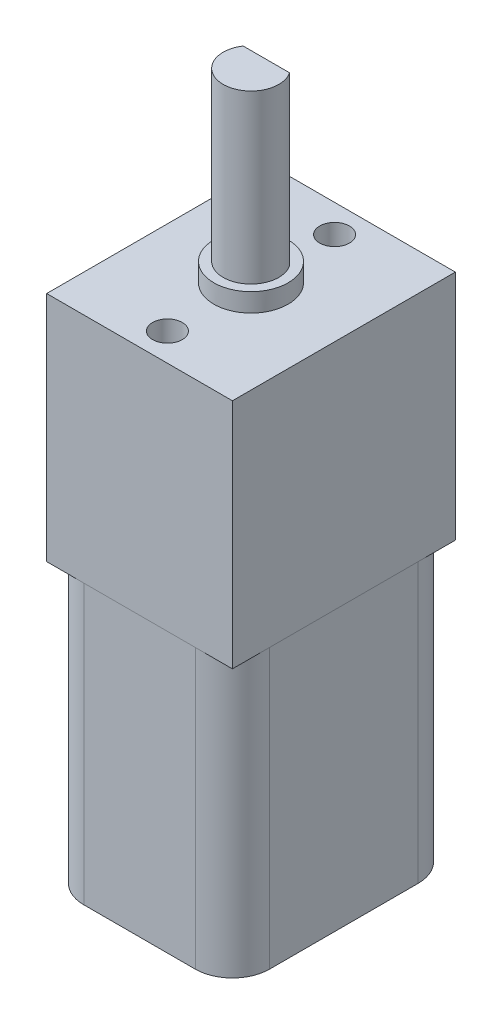
ISO-10303-21;
HEADER;
FILE_DESCRIPTION(('STEP AP214'),'2;1');
FILE_NAME('part.step','',(''),(''),'','','');
FILE_SCHEMA(('AUTOMOTIVE_DESIGN { 1 0 10303 214 1 1 1 1 }'));
ENDSEC;
DATA;
#1=APPLICATION_CONTEXT('core data for automotive mechanical design processes');
#2=APPLICATION_PROTOCOL_DEFINITION('international standard','automotive_design',2000,#1);
#3=PRODUCT_CONTEXT('',#1,'mechanical');
#4=PRODUCT('Part','Part','',(#3));
#5=PRODUCT_RELATED_PRODUCT_CATEGORY('part','',(#4));
#6=PRODUCT_DEFINITION_FORMATION('','',#4);
#7=PRODUCT_DEFINITION_CONTEXT('part definition',#1,'design');
#8=PRODUCT_DEFINITION('design','',#6,#7);
#9=PRODUCT_DEFINITION_SHAPE('','',#8);
#10=(LENGTH_UNIT() NAMED_UNIT(*) SI_UNIT(.MILLI.,.METRE.));
#11=(NAMED_UNIT(*) PLANE_ANGLE_UNIT() SI_UNIT($,.RADIAN.));
#12=(NAMED_UNIT(*) SI_UNIT($,.STERADIAN.) SOLID_ANGLE_UNIT());
#13=UNCERTAINTY_MEASURE_WITH_UNIT(LENGTH_MEASURE(1.E-05),#10,'distance_accuracy_value','');
#14=(GEOMETRIC_REPRESENTATION_CONTEXT(3) GLOBAL_UNCERTAINTY_ASSIGNED_CONTEXT((#13)) GLOBAL_UNIT_ASSIGNED_CONTEXT((#10,
#11,#12)) REPRESENTATION_CONTEXT('',''));
#15=CARTESIAN_POINT('',(0.,0.,0.));
#16=DIRECTION('',(0.,0.,1.));
#17=DIRECTION('',(1.,0.,0.));
#18=AXIS2_PLACEMENT_3D('',#15,#16,#17);
#19=CARTESIAN_POINT('',(0.,15.,0.));
#20=DIRECTION('',(0.,-1.,0.));
#21=DIRECTION('',(0.,0.,-1.));
#22=AXIS2_PLACEMENT_3D('',#19,#20,#21);
#23=PLANE('',#22);
#24=DIRECTION('',(-1.,0.,0.));
#25=VECTOR('',#24,1.);
#26=CARTESIAN_POINT('',(0.,15.,0.));
#27=LINE('',#26,#25);
#28=CARTESIAN_POINT('',(10.,15.,0.));
#29=VERTEX_POINT('',#28);
#30=CARTESIAN_POINT('',(0.,15.,0.));
#31=VERTEX_POINT('',#30);
#32=EDGE_CURVE('E127',#29,#31,#27,.T.);
#33=ORIENTED_EDGE('',*,*,#32,.T.);
#34=DIRECTION('',(0.,0.,-1.));
#35=VECTOR('',#34,1.);
#36=CARTESIAN_POINT('',(0.,15.,0.));
#37=LINE('',#36,#35);
#38=CARTESIAN_POINT('',(0.,15.,-12.));
#39=VERTEX_POINT('',#38);
#40=EDGE_CURVE('E115',#31,#39,#37,.T.);
#41=ORIENTED_EDGE('',*,*,#40,.T.);
#42=DIRECTION('',(1.,0.,0.));
#43=VECTOR('',#42,1.);
#44=CARTESIAN_POINT('',(0.,15.,-12.));
#45=LINE('',#44,#43);
#46=CARTESIAN_POINT('',(10.,15.,-12.));
#47=VERTEX_POINT('',#46);
#48=EDGE_CURVE('E121',#39,#47,#45,.T.);
#49=ORIENTED_EDGE('',*,*,#48,.T.);
#50=DIRECTION('',(0.,0.,1.));
#51=VECTOR('',#50,1.);
#52=CARTESIAN_POINT('',(10.,15.,0.));
#53=LINE('',#52,#51);
#54=EDGE_CURVE('E132',#47,#29,#53,.T.);
#55=ORIENTED_EDGE('',*,*,#54,.T.);
#56=EDGE_LOOP('',(#33,#41,#49,#55));
#57=FACE_BOUND('',#56,.T.);
#58=ADVANCED_FACE('F55',(#57),#23,.T.);
#59=CARTESIAN_POINT('',(0.,27.5,0.));
#60=DIRECTION('',(1.,0.,0.));
#61=DIRECTION('',(0.,0.,-1.));
#62=AXIS2_PLACEMENT_3D('',#59,#60,#61);
#63=PLANE('',#62);
#64=ORIENTED_EDGE('',*,*,#40,.F.);
#65=DIRECTION('',(0.,-1.,0.));
#66=VECTOR('',#65,1.);
#67=CARTESIAN_POINT('',(0.,27.5,0.));
#68=LINE('',#67,#66);
#69=CARTESIAN_POINT('',(0.,27.5,0.));
#70=VERTEX_POINT('',#69);
#71=EDGE_CURVE('E136',#70,#31,#68,.T.);
#72=ORIENTED_EDGE('',*,*,#71,.F.);
#73=DIRECTION('',(0.,0.,1.));
#74=VECTOR('',#73,1.);
#75=CARTESIAN_POINT('',(0.,27.5,0.));
#76=LINE('',#75,#74);
#77=CARTESIAN_POINT('',(0.,27.5,-12.));
#78=VERTEX_POINT('',#77);
#79=EDGE_CURVE('E113',#78,#70,#76,.T.);
#80=ORIENTED_EDGE('',*,*,#79,.F.);
#81=DIRECTION('',(0.,-1.,0.));
#82=VECTOR('',#81,1.);
#83=CARTESIAN_POINT('',(0.,27.5,-12.));
#84=LINE('',#83,#82);
#85=EDGE_CURVE('E57',#78,#39,#84,.T.);
#86=ORIENTED_EDGE('',*,*,#85,.T.);
#87=EDGE_LOOP('',(#64,#72,#80,#86));
#88=FACE_BOUND('',#87,.T.);
#89=ADVANCED_FACE('F109',(#88),#63,.F.);
#90=CARTESIAN_POINT('',(0.,27.5,0.));
#91=DIRECTION('',(0.,0.,-1.));
#92=DIRECTION('',(-1.,0.,0.));
#93=AXIS2_PLACEMENT_3D('',#90,#91,#92);
#94=PLANE('',#93);
#95=ORIENTED_EDGE('',*,*,#32,.F.);
#96=DIRECTION('',(0.,-1.,0.));
#97=VECTOR('',#96,1.);
#98=CARTESIAN_POINT('',(10.,27.5,0.));
#99=LINE('',#98,#97);
#100=CARTESIAN_POINT('',(10.,27.5,0.));
#101=VERTEX_POINT('',#100);
#102=EDGE_CURVE('E139',#101,#29,#99,.T.);
#103=ORIENTED_EDGE('',*,*,#102,.F.);
#104=DIRECTION('',(1.,0.,0.));
#105=VECTOR('',#104,1.);
#106=CARTESIAN_POINT('',(0.,27.5,0.));
#107=LINE('',#106,#105);
#108=EDGE_CURVE('E166',#70,#101,#107,.T.);
#109=ORIENTED_EDGE('',*,*,#108,.F.);
#110=ORIENTED_EDGE('',*,*,#71,.T.);
#111=EDGE_LOOP('',(#95,#103,#109,#110));
#112=FACE_BOUND('',#111,.T.);
#113=ADVANCED_FACE('F144',(#112),#94,.F.);
#114=CARTESIAN_POINT('',(10.,27.5,0.));
#115=DIRECTION('',(-1.,0.,0.));
#116=DIRECTION('',(0.,0.,1.));
#117=AXIS2_PLACEMENT_3D('',#114,#115,#116);
#118=PLANE('',#117);
#119=ORIENTED_EDGE('',*,*,#54,.F.);
#120=DIRECTION('',(0.,-1.,0.));
#121=VECTOR('',#120,1.);
#122=CARTESIAN_POINT('',(10.,27.5,-12.));
#123=LINE('',#122,#121);
#124=CARTESIAN_POINT('',(10.,27.5,-12.));
#125=VERTEX_POINT('',#124);
#126=EDGE_CURVE('E116',#125,#47,#123,.T.);
#127=ORIENTED_EDGE('',*,*,#126,.F.);
#128=DIRECTION('',(0.,0.,-1.));
#129=VECTOR('',#128,1.);
#130=CARTESIAN_POINT('',(10.,27.5,0.));
#131=LINE('',#130,#129);
#132=EDGE_CURVE('E141',#101,#125,#131,.T.);
#133=ORIENTED_EDGE('',*,*,#132,.F.);
#134=ORIENTED_EDGE('',*,*,#102,.T.);
#135=EDGE_LOOP('',(#119,#127,#133,#134));
#136=FACE_BOUND('',#135,.T.);
#137=ADVANCED_FACE('F142',(#136),#118,.F.);
#138=CARTESIAN_POINT('',(0.,27.5,-12.));
#139=DIRECTION('',(0.,0.,1.));
#140=DIRECTION('',(1.,0.,0.));
#141=AXIS2_PLACEMENT_3D('',#138,#139,#140);
#142=PLANE('',#141);
#143=ORIENTED_EDGE('',*,*,#48,.F.);
#144=ORIENTED_EDGE('',*,*,#85,.F.);
#145=DIRECTION('',(-1.,0.,0.));
#146=VECTOR('',#145,1.);
#147=CARTESIAN_POINT('',(0.,27.5,-12.));
#148=LINE('',#147,#146);
#149=EDGE_CURVE('E119',#125,#78,#148,.T.);
#150=ORIENTED_EDGE('',*,*,#149,.F.);
#151=ORIENTED_EDGE('',*,*,#126,.T.);
#152=EDGE_LOOP('',(#143,#144,#150,#151));
#153=FACE_BOUND('',#152,.T.);
#154=ADVANCED_FACE('F53',(#153),#142,.F.);
#155=CARTESIAN_POINT('',(0.,27.5,0.));
#156=DIRECTION('',(0.,-1.,0.));
#157=DIRECTION('',(0.,0.,-1.));
#158=AXIS2_PLACEMENT_3D('',#155,#156,#157);
#159=PLANE('',#158);
#160=CARTESIAN_POINT('',(5.,27.5,-10.5));
#161=DIRECTION('',(0.,1.,0.));
#162=DIRECTION('',(0.,0.,1.));
#163=AXIS2_PLACEMENT_3D('',#160,#161,#162);
#164=CIRCLE('',#163,0.79999999999999);
#165=CARTESIAN_POINT('',(5.,27.5,-9.70000000000001));
#166=VERTEX_POINT('',#165);
#167=EDGE_CURVE('E13',#166,#166,#164,.T.);
#168=ORIENTED_EDGE('',*,*,#167,.F.);
#169=EDGE_LOOP('',(#168));
#170=FACE_BOUND('',#169,.T.);
#171=CARTESIAN_POINT('',(5.,27.5,-1.5));
#172=DIRECTION('',(0.,1.,0.));
#173=DIRECTION('',(0.,0.,1.));
#174=AXIS2_PLACEMENT_3D('',#171,#172,#173);
#175=CIRCLE('',#174,0.79999999999999);
#176=CARTESIAN_POINT('',(5.,27.5,-0.700000000000011));
#177=VERTEX_POINT('',#176);
#178=EDGE_CURVE('E149',#177,#177,#175,.T.);
#179=ORIENTED_EDGE('',*,*,#178,.F.);
#180=EDGE_LOOP('',(#179));
#181=FACE_BOUND('',#180,.T.);
#182=CARTESIAN_POINT('',(5.,27.5,-6.));
#183=DIRECTION('',(0.,-1.,0.));
#184=DIRECTION('',(0.,0.,-1.));
#185=AXIS2_PLACEMENT_3D('',#182,#183,#184);
#186=CIRCLE('',#185,2.);
#187=CARTESIAN_POINT('',(5.,27.5,-8.));
#188=VERTEX_POINT('',#187);
#189=EDGE_CURVE('E130',#188,#188,#186,.F.);
#190=ORIENTED_EDGE('',*,*,#189,.F.);
#191=EDGE_LOOP('',(#190));
#192=FACE_BOUND('',#191,.T.);
#193=ORIENTED_EDGE('',*,*,#79,.T.);
#194=ORIENTED_EDGE('',*,*,#108,.T.);
#195=ORIENTED_EDGE('',*,*,#132,.T.);
#196=ORIENTED_EDGE('',*,*,#149,.T.);
#197=EDGE_LOOP('',(#193,#194,#195,#196));
#198=FACE_BOUND('',#197,.T.);
#199=ADVANCED_FACE('F176',(#170,#181,#192,#198),#159,.F.);
#200=CARTESIAN_POINT('',(5.,28.5,-6.));
#201=DIRECTION('',(0.,1.,0.));
#202=DIRECTION('',(0.,0.,1.));
#203=AXIS2_PLACEMENT_3D('',#200,#201,#202);
#204=PLANE('',#203);
#205=CARTESIAN_POINT('',(5.,28.5,-6.));
#206=DIRECTION('',(0.,1.,0.));
#207=DIRECTION('',(0.,0.,1.));
#208=AXIS2_PLACEMENT_3D('',#205,#206,#207);
#209=CIRCLE('',#208,2.);
#210=CARTESIAN_POINT('',(5.,28.5,-4.));
#211=VERTEX_POINT('',#210);
#212=EDGE_CURVE('E154',#211,#211,#209,.T.);
#213=ORIENTED_EDGE('',*,*,#212,.T.);
#214=EDGE_LOOP('',(#213));
#215=FACE_BOUND('',#214,.T.);
#216=CARTESIAN_POINT('',(5.,28.5,-6.));
#217=DIRECTION('',(0.,1.,0.));
#218=DIRECTION('',(0.,0.,1.));
#219=AXIS2_PLACEMENT_3D('',#216,#217,#218);
#220=CIRCLE('',#219,1.5);
#221=CARTESIAN_POINT('',(3.75,28.5,-6.82915619758885));
#222=VERTEX_POINT('',#221);
#223=CARTESIAN_POINT('',(6.25,28.5,-6.82915619758885));
#224=VERTEX_POINT('',#223);
#225=EDGE_CURVE('E158',#222,#224,#220,.T.);
#226=ORIENTED_EDGE('',*,*,#225,.F.);
#227=DIRECTION('',(-1.,0.,0.));
#228=VECTOR('',#227,1.);
#229=CARTESIAN_POINT('',(3.75,28.5,-6.82915619758885));
#230=LINE('',#229,#228);
#231=EDGE_CURVE('E70',#224,#222,#230,.T.);
#232=ORIENTED_EDGE('',*,*,#231,.F.);
#233=EDGE_LOOP('',(#226,#232));
#234=FACE_BOUND('',#233,.T.);
#235=ADVANCED_FACE('F185',(#215,#234),#204,.T.);
#236=CARTESIAN_POINT('',(5.,28.5,-6.));
#237=DIRECTION('',(0.,-1.,0.));
#238=DIRECTION('',(0.,0.,-1.));
#239=AXIS2_PLACEMENT_3D('',#236,#237,#238);
#240=CYLINDRICAL_SURFACE('',#239,2.);
#241=ORIENTED_EDGE('',*,*,#212,.F.);
#242=EDGE_LOOP('',(#241));
#243=FACE_BOUND('',#242,.T.);
#244=ORIENTED_EDGE('',*,*,#189,.T.);
#245=EDGE_LOOP('',(#244));
#246=FACE_BOUND('',#245,.T.);
#247=ADVANCED_FACE('F179',(#243,#246),#240,.T.);
#248=CARTESIAN_POINT('',(5.,37.5,-6.));
#249=DIRECTION('',(0.,1.,0.));
#250=DIRECTION('',(0.,0.,1.));
#251=AXIS2_PLACEMENT_3D('',#248,#249,#250);
#252=PLANE('',#251);
#253=CARTESIAN_POINT('',(5.,37.5,-6.));
#254=DIRECTION('',(0.,1.,0.));
#255=DIRECTION('',(0.,0.,1.));
#256=AXIS2_PLACEMENT_3D('',#253,#254,#255);
#257=CIRCLE('',#256,1.5);
#258=CARTESIAN_POINT('',(3.75,37.5,-6.82915619758885));
#259=VERTEX_POINT('',#258);
#260=CARTESIAN_POINT('',(6.25,37.5,-6.82915619758885));
#261=VERTEX_POINT('',#260);
#262=EDGE_CURVE('E159',#259,#261,#257,.T.);
#263=ORIENTED_EDGE('',*,*,#262,.T.);
#264=DIRECTION('',(-1.,0.,0.));
#265=VECTOR('',#264,1.);
#266=CARTESIAN_POINT('',(3.75,37.5,-6.82915619758885));
#267=LINE('',#266,#265);
#268=EDGE_CURVE('E77',#261,#259,#267,.T.);
#269=ORIENTED_EDGE('',*,*,#268,.T.);
#270=EDGE_LOOP('',(#263,#269));
#271=FACE_BOUND('',#270,.T.);
#272=ADVANCED_FACE('F224',(#271),#252,.T.);
#273=CARTESIAN_POINT('',(3.75,37.5,-6.82915619758885));
#274=DIRECTION('',(0.,0.,1.));
#275=DIRECTION('',(1.,0.,0.));
#276=AXIS2_PLACEMENT_3D('',#273,#274,#275);
#277=PLANE('',#276);
#278=DIRECTION('',(0.,-1.,0.));
#279=VECTOR('',#278,1.);
#280=CARTESIAN_POINT('',(6.25,37.5,-6.82915619758885));
#281=LINE('',#280,#279);
#282=EDGE_CURVE('E167',#261,#224,#281,.T.);
#283=ORIENTED_EDGE('',*,*,#282,.T.);
#284=ORIENTED_EDGE('',*,*,#231,.T.);
#285=DIRECTION('',(0.,-1.,0.));
#286=VECTOR('',#285,1.);
#287=CARTESIAN_POINT('',(3.75,37.5,-6.82915619758885));
#288=LINE('',#287,#286);
#289=EDGE_CURVE('E162',#259,#222,#288,.T.);
#290=ORIENTED_EDGE('',*,*,#289,.F.);
#291=ORIENTED_EDGE('',*,*,#268,.F.);
#292=EDGE_LOOP('',(#283,#284,#290,#291));
#293=FACE_BOUND('',#292,.T.);
#294=ADVANCED_FACE('F230',(#293),#277,.F.);
#295=CARTESIAN_POINT('',(5.,37.5,-6.));
#296=DIRECTION('',(0.,-1.,0.));
#297=DIRECTION('',(0.,0.,-1.));
#298=AXIS2_PLACEMENT_3D('',#295,#296,#297);
#299=CYLINDRICAL_SURFACE('',#298,1.5);
#300=ORIENTED_EDGE('',*,*,#289,.T.);
#301=ORIENTED_EDGE('',*,*,#225,.T.);
#302=ORIENTED_EDGE('',*,*,#282,.F.);
#303=ORIENTED_EDGE('',*,*,#262,.F.);
#304=EDGE_LOOP('',(#300,#301,#302,#303));
#305=FACE_BOUND('',#304,.T.);
#306=ADVANCED_FACE('F217',(#305),#299,.T.);
#307=CARTESIAN_POINT('',(5.,25.5,-1.5));
#308=DIRECTION('',(0.,-1.,0.));
#309=DIRECTION('',(0.,0.,-1.));
#310=AXIS2_PLACEMENT_3D('',#307,#308,#309);
#311=PLANE('',#310);
#312=CARTESIAN_POINT('',(5.,25.5,-1.5));
#313=DIRECTION('',(0.,1.,0.));
#314=DIRECTION('',(0.,0.,1.));
#315=AXIS2_PLACEMENT_3D('',#312,#313,#314);
#316=CIRCLE('',#315,0.799999999999996);
#317=CARTESIAN_POINT('',(5.,25.5,-0.700000000000005));
#318=VERTEX_POINT('',#317);
#319=EDGE_CURVE('E155',#318,#318,#316,.T.);
#320=ORIENTED_EDGE('',*,*,#319,.T.);
#321=EDGE_LOOP('',(#320));
#322=FACE_BOUND('',#321,.T.);
#323=ADVANCED_FACE('F214',(#322),#311,.F.);
#324=CARTESIAN_POINT('',(5.,27.5,-1.5));
#325=DIRECTION('',(0.,1.,0.));
#326=DIRECTION('',(0.,0.,1.));
#327=AXIS2_PLACEMENT_3D('',#324,#325,#326);
#328=CYLINDRICAL_SURFACE('',#327,0.799999999999993);
#329=ORIENTED_EDGE('',*,*,#319,.F.);
#330=EDGE_LOOP('',(#329));
#331=FACE_BOUND('',#330,.T.);
#332=ORIENTED_EDGE('',*,*,#178,.T.);
#333=EDGE_LOOP('',(#332));
#334=FACE_BOUND('',#333,.T.);
#335=ADVANCED_FACE('F211',(#331,#334),#328,.F.);
#336=CARTESIAN_POINT('',(5.,25.5,-10.5));
#337=DIRECTION('',(0.,-1.,0.));
#338=DIRECTION('',(0.,0.,-1.));
#339=AXIS2_PLACEMENT_3D('',#336,#337,#338);
#340=PLANE('',#339);
#341=CARTESIAN_POINT('',(5.,25.5,-10.5));
#342=DIRECTION('',(0.,1.,0.));
#343=DIRECTION('',(0.,0.,1.));
#344=AXIS2_PLACEMENT_3D('',#341,#342,#343);
#345=CIRCLE('',#344,0.799999999999997);
#346=CARTESIAN_POINT('',(5.,25.5,-9.7));
#347=VERTEX_POINT('',#346);
#348=EDGE_CURVE('E62',#347,#347,#345,.T.);
#349=ORIENTED_EDGE('',*,*,#348,.T.);
#350=EDGE_LOOP('',(#349));
#351=FACE_BOUND('',#350,.T.);
#352=ADVANCED_FACE('F210',(#351),#340,.F.);
#353=CARTESIAN_POINT('',(5.,27.5,-10.5));
#354=DIRECTION('',(0.,1.,0.));
#355=DIRECTION('',(0.,0.,1.));
#356=AXIS2_PLACEMENT_3D('',#353,#354,#355);
#357=CYLINDRICAL_SURFACE('',#356,0.799999999999993);
#358=ORIENTED_EDGE('',*,*,#348,.F.);
#359=EDGE_LOOP('',(#358));
#360=FACE_BOUND('',#359,.T.);
#361=ORIENTED_EDGE('',*,*,#167,.T.);
#362=EDGE_LOOP('',(#361));
#363=FACE_BOUND('',#362,.T.);
#364=ADVANCED_FACE('F203',(#360,#363),#357,.F.);
#365=CLOSED_SHELL('',(#58,#89,#113,#137,#154,#199,#235,#247,#272,#294,#306,#323,#335,#352,#364));
#366=MANIFOLD_SOLID_BREP('B2',#365);
#367=CARTESIAN_POINT('',(0.,15.,0.));
#368=DIRECTION('',(0.,-1.,0.));
#369=DIRECTION('',(0.,0.,-1.));
#370=AXIS2_PLACEMENT_3D('',#367,#368,#369);
#371=PLANE('',#370);
#372=DIRECTION('',(0.,0.,1.));
#373=VECTOR('',#372,1.);
#374=CARTESIAN_POINT('',(10.,15.,0.));
#375=LINE('',#374,#373);
#376=CARTESIAN_POINT('',(10.,15.,-10.));
#377=VERTEX_POINT('',#376);
#378=CARTESIAN_POINT('',(10.,15.,-2.));
#379=VERTEX_POINT('',#378);
#380=EDGE_CURVE('E379',#377,#379,#375,.T.);
#381=ORIENTED_EDGE('',*,*,#380,.F.);
#382=CARTESIAN_POINT('',(8.,15.,-10.));
#383=DIRECTION('',(0.,-1.,0.));
#384=DIRECTION('',(0.,0.,-1.));
#385=AXIS2_PLACEMENT_3D('',#382,#383,#384);
#386=CIRCLE('',#385,2.);
#387=CARTESIAN_POINT('',(8.,15.,-12.));
#388=VERTEX_POINT('',#387);
#389=EDGE_CURVE('E377',#377,#388,#386,.F.);
#390=ORIENTED_EDGE('',*,*,#389,.T.);
#391=DIRECTION('',(1.,0.,0.));
#392=VECTOR('',#391,1.);
#393=CARTESIAN_POINT('',(0.,15.,-12.));
#394=LINE('',#393,#392);
#395=CARTESIAN_POINT('',(2.,15.,-12.));
#396=VERTEX_POINT('',#395);
#397=EDGE_CURVE('E369',#396,#388,#394,.T.);
#398=ORIENTED_EDGE('',*,*,#397,.F.);
#399=CARTESIAN_POINT('',(2.,15.,-10.));
#400=DIRECTION('',(0.,-1.,0.));
#401=DIRECTION('',(0.,0.,-1.));
#402=AXIS2_PLACEMENT_3D('',#399,#400,#401);
#403=CIRCLE('',#402,2.);
#404=CARTESIAN_POINT('',(0.,15.,-10.));
#405=VERTEX_POINT('',#404);
#406=EDGE_CURVE('E314',#396,#405,#403,.F.);
#407=ORIENTED_EDGE('',*,*,#406,.T.);
#408=DIRECTION('',(0.,0.,-1.));
#409=VECTOR('',#408,1.);
#410=CARTESIAN_POINT('',(0.,15.,0.));
#411=LINE('',#410,#409);
#412=CARTESIAN_POINT('',(0.,15.,-2.));
#413=VERTEX_POINT('',#412);
#414=EDGE_CURVE('E374',#413,#405,#411,.T.);
#415=ORIENTED_EDGE('',*,*,#414,.F.);
#416=CARTESIAN_POINT('',(2.,15.,-2.));
#417=DIRECTION('',(0.,-1.,0.));
#418=DIRECTION('',(0.,0.,-1.));
#419=AXIS2_PLACEMENT_3D('',#416,#417,#418);
#420=CIRCLE('',#419,2.);
#421=CARTESIAN_POINT('',(2.,15.,0.));
#422=VERTEX_POINT('',#421);
#423=EDGE_CURVE('E388',#413,#422,#420,.F.);
#424=ORIENTED_EDGE('',*,*,#423,.T.);
#425=DIRECTION('',(-1.,0.,0.));
#426=VECTOR('',#425,1.);
#427=CARTESIAN_POINT('',(0.,15.,0.));
#428=LINE('',#427,#426);
#429=CARTESIAN_POINT('',(8.,15.,0.));
#430=VERTEX_POINT('',#429);
#431=EDGE_CURVE('E403',#430,#422,#428,.T.);
#432=ORIENTED_EDGE('',*,*,#431,.F.);
#433=CARTESIAN_POINT('',(8.,15.,-2.));
#434=DIRECTION('',(0.,-1.,0.));
#435=DIRECTION('',(0.,0.,-1.));
#436=AXIS2_PLACEMENT_3D('',#433,#434,#435);
#437=CIRCLE('',#436,2.);
#438=EDGE_CURVE('E390',#430,#379,#437,.F.);
#439=ORIENTED_EDGE('',*,*,#438,.T.);
#440=EDGE_LOOP('',(#381,#390,#398,#407,#415,#424,#432,#439));
#441=FACE_BOUND('',#440,.T.);
#442=ADVANCED_FACE('F299',(#441),#371,.F.);
#443=CARTESIAN_POINT('',(5.,-2.,-6.));
#444=DIRECTION('',(0.,-1.,0.));
#445=DIRECTION('',(0.,0.,-1.));
#446=AXIS2_PLACEMENT_3D('',#443,#444,#445);
#447=PLANE('',#446);
#448=CARTESIAN_POINT('',(5.,-2.,-6.));
#449=DIRECTION('',(0.,-1.,0.));
#450=DIRECTION('',(0.,0.,-1.));
#451=AXIS2_PLACEMENT_3D('',#448,#449,#450);
#452=CIRCLE('',#451,2.5);
#453=CARTESIAN_POINT('',(5.,-2.,-8.5));
#454=VERTEX_POINT('',#453);
#455=EDGE_CURVE('E420',#454,#454,#452,.T.);
#456=ORIENTED_EDGE('',*,*,#455,.T.);
#457=EDGE_LOOP('',(#456));
#458=FACE_BOUND('',#457,.T.);
#459=ADVANCED_FACE('F450',(#458),#447,.T.);
#460=CARTESIAN_POINT('',(5.,-2.,-6.));
#461=DIRECTION('',(0.,1.,0.));
#462=DIRECTION('',(0.,0.,1.));
#463=AXIS2_PLACEMENT_3D('',#460,#461,#462);
#464=CYLINDRICAL_SURFACE('',#463,2.5);
#465=ORIENTED_EDGE('',*,*,#455,.F.);
#466=EDGE_LOOP('',(#465));
#467=FACE_BOUND('',#466,.T.);
#468=CARTESIAN_POINT('',(5.,0.,-6.));
#469=DIRECTION('',(0.,-1.,0.));
#470=DIRECTION('',(0.,0.,-1.));
#471=AXIS2_PLACEMENT_3D('',#468,#469,#470);
#472=CIRCLE('',#471,2.5);
#473=CARTESIAN_POINT('',(5.,0.,-8.5));
#474=VERTEX_POINT('',#473);
#475=EDGE_CURVE('E381',#474,#474,#472,.T.);
#476=ORIENTED_EDGE('',*,*,#475,.T.);
#477=EDGE_LOOP('',(#476));
#478=FACE_BOUND('',#477,.T.);
#479=ADVANCED_FACE('F451',(#467,#478),#464,.T.);
#480=CARTESIAN_POINT('',(0.,27.5,0.));
#481=DIRECTION('',(0.,0.,-1.));
#482=DIRECTION('',(-1.,0.,0.));
#483=AXIS2_PLACEMENT_3D('',#480,#481,#482);
#484=PLANE('',#483);
#485=DIRECTION('',(1.,0.,0.));
#486=VECTOR('',#485,1.);
#487=CARTESIAN_POINT('',(0.,0.,0.));
#488=LINE('',#487,#486);
#489=CARTESIAN_POINT('',(2.,0.,0.));
#490=VERTEX_POINT('',#489);
#491=CARTESIAN_POINT('',(8.,0.,0.));
#492=VERTEX_POINT('',#491);
#493=EDGE_CURVE('E405',#490,#492,#488,.T.);
#494=ORIENTED_EDGE('',*,*,#493,.T.);
#495=DIRECTION('',(0.,-1.,0.));
#496=VECTOR('',#495,1.);
#497=CARTESIAN_POINT('',(8.,27.5,0.));
#498=LINE('',#497,#496);
#499=EDGE_CURVE('E49',#492,#430,#498,.F.);
#500=ORIENTED_EDGE('',*,*,#499,.T.);
#501=ORIENTED_EDGE('',*,*,#431,.T.);
#502=DIRECTION('',(0.,-1.,0.));
#503=VECTOR('',#502,1.);
#504=CARTESIAN_POINT('',(2.,27.5,0.));
#505=LINE('',#504,#503);
#506=EDGE_CURVE('E307',#422,#490,#505,.T.);
#507=ORIENTED_EDGE('',*,*,#506,.T.);
#508=EDGE_LOOP('',(#494,#500,#501,#507));
#509=FACE_BOUND('',#508,.T.);
#510=ADVANCED_FACE('F402',(#509),#484,.F.);
#511=CARTESIAN_POINT('',(0.,0.,0.));
#512=DIRECTION('',(0.,-1.,0.));
#513=DIRECTION('',(0.,0.,-1.));
#514=AXIS2_PLACEMENT_3D('',#511,#512,#513);
#515=PLANE('',#514);
#516=ORIENTED_EDGE('',*,*,#475,.F.);
#517=EDGE_LOOP('',(#516));
#518=FACE_BOUND('',#517,.T.);
#519=DIRECTION('',(-1.,0.,0.));
#520=VECTOR('',#519,1.);
#521=CARTESIAN_POINT('',(0.,0.,-12.));
#522=LINE('',#521,#520);
#523=CARTESIAN_POINT('',(8.,0.,-12.));
#524=VERTEX_POINT('',#523);
#525=CARTESIAN_POINT('',(2.,0.,-12.));
#526=VERTEX_POINT('',#525);
#527=EDGE_CURVE('E375',#524,#526,#522,.T.);
#528=ORIENTED_EDGE('',*,*,#527,.F.);
#529=CARTESIAN_POINT('',(8.,0.,-10.));
#530=DIRECTION('',(0.,-1.,0.));
#531=DIRECTION('',(0.,0.,-1.));
#532=AXIS2_PLACEMENT_3D('',#529,#530,#531);
#533=CIRCLE('',#532,2.);
#534=CARTESIAN_POINT('',(10.,0.,-10.));
#535=VERTEX_POINT('',#534);
#536=EDGE_CURVE('E433',#524,#535,#533,.T.);
#537=ORIENTED_EDGE('',*,*,#536,.T.);
#538=DIRECTION('',(0.,0.,-1.));
#539=VECTOR('',#538,1.);
#540=CARTESIAN_POINT('',(10.,0.,0.));
#541=LINE('',#540,#539);
#542=CARTESIAN_POINT('',(10.,0.,-2.));
#543=VERTEX_POINT('',#542);
#544=EDGE_CURVE('E413',#543,#535,#541,.T.);
#545=ORIENTED_EDGE('',*,*,#544,.F.);
#546=CARTESIAN_POINT('',(8.,0.,-2.));
#547=DIRECTION('',(0.,-1.,0.));
#548=DIRECTION('',(0.,0.,-1.));
#549=AXIS2_PLACEMENT_3D('',#546,#547,#548);
#550=CIRCLE('',#549,2.);
#551=EDGE_CURVE('E414',#543,#492,#550,.T.);
#552=ORIENTED_EDGE('',*,*,#551,.T.);
#553=ORIENTED_EDGE('',*,*,#493,.F.);
#554=CARTESIAN_POINT('',(2.,0.,-2.));
#555=DIRECTION('',(0.,-1.,0.));
#556=DIRECTION('',(0.,0.,-1.));
#557=AXIS2_PLACEMENT_3D('',#554,#555,#556);
#558=CIRCLE('',#557,2.);
#559=CARTESIAN_POINT('',(0.,0.,-2.));
#560=VERTEX_POINT('',#559);
#561=EDGE_CURVE('E411',#490,#560,#558,.T.);
#562=ORIENTED_EDGE('',*,*,#561,.T.);
#563=DIRECTION('',(0.,0.,1.));
#564=VECTOR('',#563,1.);
#565=CARTESIAN_POINT('',(0.,0.,0.));
#566=LINE('',#565,#564);
#567=CARTESIAN_POINT('',(0.,0.,-10.));
#568=VERTEX_POINT('',#567);
#569=EDGE_CURVE('E415',#568,#560,#566,.T.);
#570=ORIENTED_EDGE('',*,*,#569,.F.);
#571=CARTESIAN_POINT('',(2.,0.,-10.));
#572=DIRECTION('',(0.,-1.,0.));
#573=DIRECTION('',(0.,0.,-1.));
#574=AXIS2_PLACEMENT_3D('',#571,#572,#573);
#575=CIRCLE('',#574,2.);
#576=EDGE_CURVE('E431',#568,#526,#575,.T.);
#577=ORIENTED_EDGE('',*,*,#576,.T.);
#578=EDGE_LOOP('',(#528,#537,#545,#552,#553,#562,#570,#577));
#579=FACE_BOUND('',#578,.T.);
#580=ADVANCED_FACE('F409',(#518,#579),#515,.T.);
#581=CARTESIAN_POINT('',(10.,27.5,0.));
#582=DIRECTION('',(-1.,0.,0.));
#583=DIRECTION('',(0.,0.,1.));
#584=AXIS2_PLACEMENT_3D('',#581,#582,#583);
#585=PLANE('',#584);
#586=ORIENTED_EDGE('',*,*,#544,.T.);
#587=DIRECTION('',(0.,-1.,0.));
#588=VECTOR('',#587,1.);
#589=CARTESIAN_POINT('',(10.,27.5,-10.));
#590=LINE('',#589,#588);
#591=EDGE_CURVE('E437',#535,#377,#590,.F.);
#592=ORIENTED_EDGE('',*,*,#591,.T.);
#593=ORIENTED_EDGE('',*,*,#380,.T.);
#594=DIRECTION('',(0.,-1.,0.));
#595=VECTOR('',#594,1.);
#596=CARTESIAN_POINT('',(10.,27.5,-2.));
#597=LINE('',#596,#595);
#598=EDGE_CURVE('E434',#379,#543,#597,.T.);
#599=ORIENTED_EDGE('',*,*,#598,.T.);
#600=EDGE_LOOP('',(#586,#592,#593,#599));
#601=FACE_BOUND('',#600,.T.);
#602=ADVANCED_FACE('F469',(#601),#585,.F.);
#603=CARTESIAN_POINT('',(0.,27.5,0.));
#604=DIRECTION('',(1.,0.,0.));
#605=DIRECTION('',(0.,0.,-1.));
#606=AXIS2_PLACEMENT_3D('',#603,#604,#605);
#607=PLANE('',#606);
#608=ORIENTED_EDGE('',*,*,#414,.T.);
#609=DIRECTION('',(0.,-1.,0.));
#610=VECTOR('',#609,1.);
#611=CARTESIAN_POINT('',(0.,27.5,-10.));
#612=LINE('',#611,#610);
#613=EDGE_CURVE('E387',#405,#568,#612,.T.);
#614=ORIENTED_EDGE('',*,*,#613,.T.);
#615=ORIENTED_EDGE('',*,*,#569,.T.);
#616=DIRECTION('',(0.,-1.,0.));
#617=VECTOR('',#616,1.);
#618=CARTESIAN_POINT('',(0.,27.5,-2.));
#619=LINE('',#618,#617);
#620=EDGE_CURVE('E321',#560,#413,#619,.F.);
#621=ORIENTED_EDGE('',*,*,#620,.T.);
#622=EDGE_LOOP('',(#608,#614,#615,#621));
#623=FACE_BOUND('',#622,.T.);
#624=ADVANCED_FACE('F462',(#623),#607,.F.);
#625=CARTESIAN_POINT('',(0.,27.5,-12.));
#626=DIRECTION('',(0.,0.,1.));
#627=DIRECTION('',(1.,0.,0.));
#628=AXIS2_PLACEMENT_3D('',#625,#626,#627);
#629=PLANE('',#628);
#630=ORIENTED_EDGE('',*,*,#397,.T.);
#631=DIRECTION('',(0.,-1.,0.));
#632=VECTOR('',#631,1.);
#633=CARTESIAN_POINT('',(8.,27.5,-12.));
#634=LINE('',#633,#632);
#635=EDGE_CURVE('E372',#388,#524,#634,.T.);
#636=ORIENTED_EDGE('',*,*,#635,.T.);
#637=ORIENTED_EDGE('',*,*,#527,.T.);
#638=DIRECTION('',(0.,-1.,0.));
#639=VECTOR('',#638,1.);
#640=CARTESIAN_POINT('',(2.,27.5,-12.));
#641=LINE('',#640,#639);
#642=EDGE_CURVE('E368',#526,#396,#641,.F.);
#643=ORIENTED_EDGE('',*,*,#642,.T.);
#644=EDGE_LOOP('',(#630,#636,#637,#643));
#645=FACE_BOUND('',#644,.T.);
#646=ADVANCED_FACE('F370',(#645),#629,.F.);
#647=CARTESIAN_POINT('',(8.,27.5,-10.));
#648=DIRECTION('',(0.,-1.,0.));
#649=DIRECTION('',(0.,0.,-1.));
#650=AXIS2_PLACEMENT_3D('',#647,#648,#649);
#651=CYLINDRICAL_SURFACE('',#650,2.);
#652=ORIENTED_EDGE('',*,*,#389,.F.);
#653=ORIENTED_EDGE('',*,*,#591,.F.);
#654=ORIENTED_EDGE('',*,*,#536,.F.);
#655=ORIENTED_EDGE('',*,*,#635,.F.);
#656=EDGE_LOOP('',(#652,#653,#654,#655));
#657=FACE_BOUND('',#656,.T.);
#658=ADVANCED_FACE('F460',(#657),#651,.T.);
#659=CARTESIAN_POINT('',(2.,27.5,-10.));
#660=DIRECTION('',(0.,-1.,0.));
#661=DIRECTION('',(0.,0.,-1.));
#662=AXIS2_PLACEMENT_3D('',#659,#660,#661);
#663=CYLINDRICAL_SURFACE('',#662,2.);
#664=ORIENTED_EDGE('',*,*,#406,.F.);
#665=ORIENTED_EDGE('',*,*,#642,.F.);
#666=ORIENTED_EDGE('',*,*,#576,.F.);
#667=ORIENTED_EDGE('',*,*,#613,.F.);
#668=EDGE_LOOP('',(#664,#665,#666,#667));
#669=FACE_BOUND('',#668,.T.);
#670=ADVANCED_FACE('F383',(#669),#663,.T.);
#671=CARTESIAN_POINT('',(8.,27.5,-2.));
#672=DIRECTION('',(0.,-1.,0.));
#673=DIRECTION('',(0.,0.,-1.));
#674=AXIS2_PLACEMENT_3D('',#671,#672,#673);
#675=CYLINDRICAL_SURFACE('',#674,2.);
#676=ORIENTED_EDGE('',*,*,#438,.F.);
#677=ORIENTED_EDGE('',*,*,#499,.F.);
#678=ORIENTED_EDGE('',*,*,#551,.F.);
#679=ORIENTED_EDGE('',*,*,#598,.F.);
#680=EDGE_LOOP('',(#676,#677,#678,#679));
#681=FACE_BOUND('',#680,.T.);
#682=ADVANCED_FACE('F442',(#681),#675,.T.);
#683=CARTESIAN_POINT('',(2.,27.5,-2.));
#684=DIRECTION('',(0.,-1.,0.));
#685=DIRECTION('',(0.,0.,-1.));
#686=AXIS2_PLACEMENT_3D('',#683,#684,#685);
#687=CYLINDRICAL_SURFACE('',#686,2.);
#688=ORIENTED_EDGE('',*,*,#423,.F.);
#689=ORIENTED_EDGE('',*,*,#620,.F.);
#690=ORIENTED_EDGE('',*,*,#561,.F.);
#691=ORIENTED_EDGE('',*,*,#506,.F.);
#692=EDGE_LOOP('',(#688,#689,#690,#691));
#693=FACE_BOUND('',#692,.T.);
#694=ADVANCED_FACE('F301',(#693),#687,.T.);
#695=CLOSED_SHELL('',(#442,#459,#479,#510,#580,#602,#624,#646,#658,#670,#682,#694));
#696=MANIFOLD_SOLID_BREP('B7',#695);
#697=ADVANCED_BREP_SHAPE_REPRESENTATION('',(#18,#366,#696),#14);
#698=SHAPE_DEFINITION_REPRESENTATION(#9,#697);
ENDSEC;
END-ISO-10303-21;
